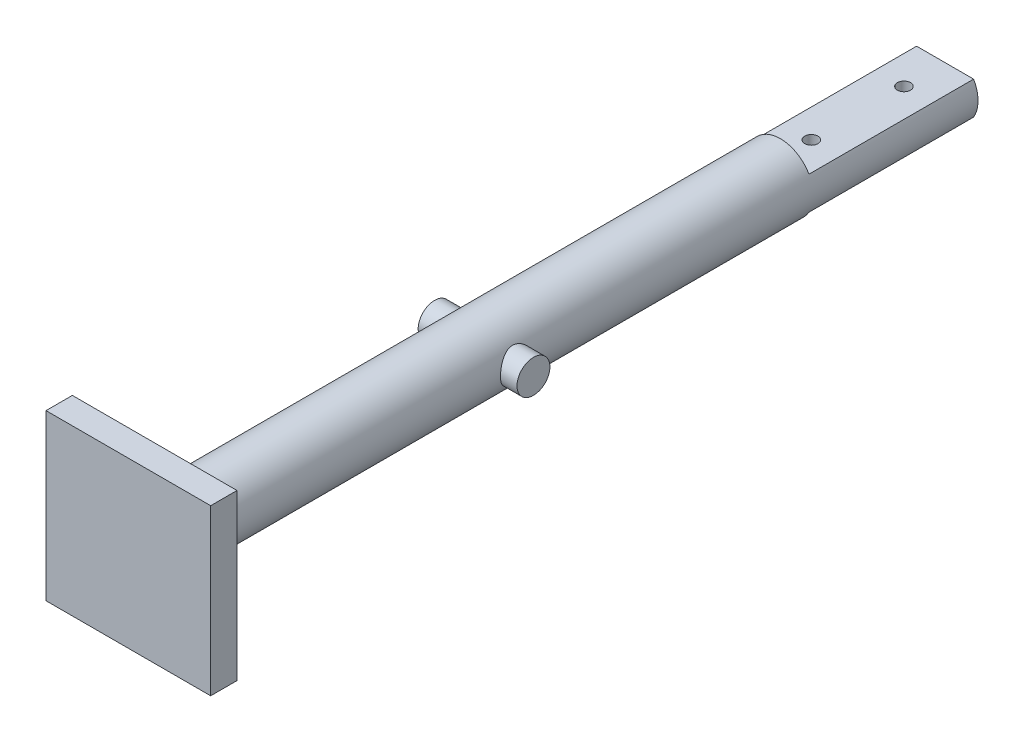
ISO-10303-21;
HEADER;
FILE_DESCRIPTION(('STEP AP214'),'2;1');
FILE_NAME('part.step','',(''),(''),'','','');
FILE_SCHEMA(('AUTOMOTIVE_DESIGN { 1 0 10303 214 1 1 1 1 }'));
ENDSEC;
DATA;
#1=APPLICATION_CONTEXT('core data for automotive mechanical design processes');
#2=APPLICATION_PROTOCOL_DEFINITION('international standard','automotive_design',2000,#1);
#3=PRODUCT_CONTEXT('',#1,'mechanical');
#4=PRODUCT('Part','Part','',(#3));
#5=PRODUCT_RELATED_PRODUCT_CATEGORY('part','',(#4));
#6=PRODUCT_DEFINITION_FORMATION('','',#4);
#7=PRODUCT_DEFINITION_CONTEXT('part definition',#1,'design');
#8=PRODUCT_DEFINITION('design','',#6,#7);
#9=PRODUCT_DEFINITION_SHAPE('','',#8);
#10=(LENGTH_UNIT() NAMED_UNIT(*) SI_UNIT(.MILLI.,.METRE.));
#11=(NAMED_UNIT(*) PLANE_ANGLE_UNIT() SI_UNIT($,.RADIAN.));
#12=(NAMED_UNIT(*) SI_UNIT($,.STERADIAN.) SOLID_ANGLE_UNIT());
#13=UNCERTAINTY_MEASURE_WITH_UNIT(LENGTH_MEASURE(1.E-05),#10,'distance_accuracy_value','');
#14=(GEOMETRIC_REPRESENTATION_CONTEXT(3) GLOBAL_UNCERTAINTY_ASSIGNED_CONTEXT((#13)) GLOBAL_UNIT_ASSIGNED_CONTEXT((#10,
#11,#12)) REPRESENTATION_CONTEXT('',''));
#15=CARTESIAN_POINT('',(0.,0.,0.));
#16=DIRECTION('',(0.,0.,1.));
#17=DIRECTION('',(1.,0.,0.));
#18=AXIS2_PLACEMENT_3D('',#15,#16,#17);
#19=CARTESIAN_POINT('',(0.,0.,152.4));
#20=DIRECTION('',(0.,0.,-1.));
#21=DIRECTION('',(-1.,0.,0.));
#22=AXIS2_PLACEMENT_3D('',#19,#20,#21);
#23=CYLINDRICAL_SURFACE('',#22,12.7);
#24=CARTESIAN_POINT('',(0.,0.,152.4));
#25=DIRECTION('',(0.,0.,1.));
#26=DIRECTION('',(1.,0.,0.));
#27=AXIS2_PLACEMENT_3D('',#24,#25,#26);
#28=CIRCLE('',#27,12.7);
#29=CARTESIAN_POINT('',(12.7,0.,152.4));
#30=VERTEX_POINT('',#29);
#31=EDGE_CURVE('E134',#30,#30,#28,.T.);
#32=ORIENTED_EDGE('',*,*,#31,.F.);
#33=EDGE_LOOP('',(#32));
#34=FACE_BOUND('',#33,.T.);
#35=CARTESIAN_POINT('',(12.7,0.,31.75));
#36=CARTESIAN_POINT('',(12.6999994891774,-0.166990879194916,31.7499994421759));
#37=CARTESIAN_POINT('',(12.6966986728259,-0.333993450198633,31.7434051711993));
#38=CARTESIAN_POINT('',(12.6835786203218,-0.666768526640046,31.7171033286682));
#39=CARTESIAN_POINT('',(12.6737565484519,-0.832540465223131,31.6973900524076));
#40=CARTESIAN_POINT('',(12.6478292478082,-1.16177467728404,31.6450462013111));
#41=CARTESIAN_POINT('',(12.6317150589571,-1.32523331106835,31.6123972048197));
#42=CARTESIAN_POINT('',(12.5936085062318,-1.64849348247789,31.5345436700231));
#43=CARTESIAN_POINT('',(12.5716137398496,-1.80829349634147,31.4893339997623));
#44=CARTESIAN_POINT('',(12.5223959142721,-2.12244180878878,31.3870611803294));
#45=CARTESIAN_POINT('',(12.4951959650805,-2.27681076158406,31.3300503379438));
#46=CARTESIAN_POINT('',(12.4361502699189,-2.57993454237572,31.2046002780589));
#47=CARTESIAN_POINT('',(12.4043027843762,-2.72868724185101,31.1361567799234));
#48=CARTESIAN_POINT('',(12.302881193969,-3.16512812193647,30.9145916735138));
#49=CARTESIAN_POINT('',(12.2273713354024,-3.44334503957524,30.7451216410392));
#50=CARTESIAN_POINT('',(12.0622186773861,-3.98471796121714,30.3560574939862));
#51=CARTESIAN_POINT('',(11.9719972312188,-4.24594454614362,30.1340512417935));
#52=CARTESIAN_POINT('',(11.7893960148839,-4.72936553155196,29.6511481911964));
#53=CARTESIAN_POINT('',(11.6970146601478,-4.95153018780439,29.3902220337443));
#54=CARTESIAN_POINT('',(11.5603243398217,-5.25955398778229,28.9628248667093));
#55=CARTESIAN_POINT('',(11.5134721485475,-5.36106270491311,28.8082038937614));
#56=CARTESIAN_POINT('',(11.4233099497228,-5.55058368760465,28.4899476154752));
#57=CARTESIAN_POINT('',(11.3799984680683,-5.63860158329209,28.3263161094703));
#58=CARTESIAN_POINT('',(11.2984098057888,-5.80035808289101,27.9909478644053));
#59=CARTESIAN_POINT('',(11.2601322945723,-5.87409762464254,27.8192116586054));
#60=CARTESIAN_POINT('',(11.1900882100936,-6.0064578883652,27.4688169432002));
#61=CARTESIAN_POINT('',(11.1583177917589,-6.06508754416238,27.2901625962078));
#62=CARTESIAN_POINT('',(11.104259497995,-6.16347180761614,26.9380237910296));
#63=CARTESIAN_POINT('',(11.08151961136,-6.20414249112448,26.7648649825109));
#64=CARTESIAN_POINT('',(11.0438804844397,-6.27089941680449,26.4149100900955));
#65=CARTESIAN_POINT('',(11.0289809087597,-6.29698628284914,26.2381141621246));
#66=CARTESIAN_POINT('',(11.0076763086803,-6.33415533919378,25.8825907052358));
#67=CARTESIAN_POINT('',(11.0012640993806,-6.34525022098377,25.7038649394044));
#68=CARTESIAN_POINT('',(10.9972004886715,-6.3522911075755,25.3460234576935));
#69=CARTESIAN_POINT('',(10.9995482514047,-6.34823855771195,25.1669077806485));
#70=CARTESIAN_POINT('',(11.012090292946,-6.32645177136463,24.8314176981249));
#71=CARTESIAN_POINT('',(11.0213095833287,-6.31041699475489,24.6748926401298));
#72=CARTESIAN_POINT('',(11.046128374712,-6.26687134491481,24.3639094653422));
#73=CARTESIAN_POINT('',(11.0617299789813,-6.23935668847138,24.2094520472784));
#74=CARTESIAN_POINT('',(11.0988027904553,-6.17316873448519,23.903688703298));
#75=CARTESIAN_POINT('',(11.120273227066,-6.13449690187388,23.7523823664405));
#76=CARTESIAN_POINT('',(11.1684190383084,-6.04639785576763,23.4537613579966));
#77=CARTESIAN_POINT('',(11.1950964580098,-5.99696641549927,23.3064482807581));
#78=CARTESIAN_POINT('',(11.2831376118079,-5.83067999912413,22.8650712730653));
#79=CARTESIAN_POINT('',(11.351625656313,-5.69733157989736,22.5784494378061));
#80=CARTESIAN_POINT('',(11.500071400071,-5.39139880582654,22.0304231498828));
#81=CARTESIAN_POINT('',(11.5800342452273,-5.2187968272065,21.76903009957));
#82=CARTESIAN_POINT('',(11.7546812882032,-4.81373716307424,21.2438125690412));
#83=CARTESIAN_POINT('',(11.8499465086129,-4.57646495884523,20.9838823296492));
#84=CARTESIAN_POINT('',(12.0362854764244,-4.06112275052911,20.5057965991382));
#85=CARTESIAN_POINT('',(12.1273572049436,-3.78303336001456,20.2876610728589));
#86=CARTESIAN_POINT('',(12.255938857257,-3.33286643739698,19.9917786254828));
#87=CARTESIAN_POINT('',(12.2983050254296,-3.17335722609792,19.8966401532776));
#88=CARTESIAN_POINT('',(12.3782218301755,-2.84569771626439,19.7202932887563));
#89=CARTESIAN_POINT('',(12.4157746297482,-2.67755134695863,19.6390786338707));
#90=CARTESIAN_POINT('',(12.4849579292559,-2.33378760343932,19.4914534288931));
#91=CARTESIAN_POINT('',(12.5165907293456,-2.15817316355139,19.4250371271345));
#92=CARTESIAN_POINT('',(12.5729876360055,-1.80074808519268,19.3077783400175));
#93=CARTESIAN_POINT('',(12.5977525327026,-1.61893816219403,19.2569340630848));
#94=CARTESIAN_POINT('',(12.6378915597613,-1.26593635485429,19.1750530402546));
#95=CARTESIAN_POINT('',(12.6538736459652,-1.09511243698787,19.1427244136913));
#96=CARTESIAN_POINT('',(12.6789562420375,-0.750891318848445,19.0921544116368));
#97=CARTESIAN_POINT('',(12.6880571262137,-0.577494259066557,19.0739122699002));
#98=CARTESIAN_POINT('',(12.6991158370576,-0.229629611373425,19.0517612761007));
#99=CARTESIAN_POINT('',(12.7010765197081,-0.0551624794535693,19.0478466932071));
#100=CARTESIAN_POINT('',(12.6978059034872,0.293430507417566,19.0543886079494));
#101=CARTESIAN_POINT('',(12.6925749229034,0.467556377130832,19.0648444695801));
#102=CARTESIAN_POINT('',(12.6757555094506,0.80050953674407,19.0986136315206));
#103=CARTESIAN_POINT('',(12.6646934781011,0.959472887164146,19.1208630740019));
#104=CARTESIAN_POINT('',(12.6368459564446,1.2748284005213,19.1772211624817));
#105=CARTESIAN_POINT('',(12.6200585231077,1.43121967165999,19.2113338345825));
#106=CARTESIAN_POINT('',(12.581159973299,1.74030776864039,19.291047952959));
#107=CARTESIAN_POINT('',(12.5590505630802,1.89300576133385,19.3366457172722));
#108=CARTESIAN_POINT('',(12.5099971792976,2.19390570072534,19.4389143910584));
#109=CARTESIAN_POINT('',(12.4830513245292,2.34210587161403,19.4955896100324));
#110=CARTESIAN_POINT('',(12.4240951779885,2.6372585623889,19.6212622939719));
#111=CARTESIAN_POINT('',(12.3919635638501,2.78405822350622,19.6905620050969));
#112=CARTESIAN_POINT('',(12.32392525103,3.07126756713195,19.8397813940777));
#113=CARTESIAN_POINT('',(12.2880172735192,3.21167506178122,19.9197046719357));
#114=CARTESIAN_POINT('',(12.1757741292216,3.62227376445688,20.1745491136814));
#115=CARTESIAN_POINT('',(12.0948877082824,3.88199540128409,20.364611078788));
#116=CARTESIAN_POINT('',(11.9194499483036,4.39279994151145,20.8011398441673));
#117=CARTESIAN_POINT('',(11.8243367236915,4.64052990372701,21.0513128051332));
#118=CARTESIAN_POINT('',(11.6839772811164,4.9789239543965,21.4549100898515));
#119=CARTESIAN_POINT('',(11.6375432562751,5.08625380253176,21.5942761051402));
#120=CARTESIAN_POINT('',(11.5466734049483,5.28929908879009,21.881933742679));
#121=CARTESIAN_POINT('',(11.5022378780468,5.38501278922794,22.0302266953779));
#122=CARTESIAN_POINT('',(11.4145838039713,5.56849389071525,22.3424281006111));
#123=CARTESIAN_POINT('',(11.3715304916549,5.65564549590477,22.5067454440508));
#124=CARTESIAN_POINT('',(11.290579644901,5.81556909376681,22.8433705339));
#125=CARTESIAN_POINT('',(11.2526796279935,5.88834801781484,23.015674378989));
#126=CARTESIAN_POINT('',(11.1834979926119,6.01870593214495,23.3670791641593));
#127=CARTESIAN_POINT('',(11.1522110654534,6.07629712370974,23.5461745150593));
#128=CARTESIAN_POINT('',(11.0975495796607,6.17556605056229,23.9098983380202));
#129=CARTESIAN_POINT('',(11.0741737959829,6.21724624980145,24.0945259485842));
#130=CARTESIAN_POINT('',(11.038221566145,6.28083303239844,24.4497382585254));
#131=CARTESIAN_POINT('',(11.0248238589961,6.30425367574492,24.6199696991849));
#132=CARTESIAN_POINT('',(11.0059068618669,6.33722186745437,24.9622059736914));
#133=CARTESIAN_POINT('',(11.0003870360907,6.34677035930014,25.1342106861318));
#134=CARTESIAN_POINT('',(10.9974561088362,6.35184755649859,25.4784312834341));
#135=CARTESIAN_POINT('',(11.0000420081603,6.34738144738997,25.6506470666262));
#136=CARTESIAN_POINT('',(11.0132073594892,6.32451076696087,25.9938336660463));
#137=CARTESIAN_POINT('',(11.023786484255,6.3061067662514,26.1648045329513));
#138=CARTESIAN_POINT('',(11.0511312712702,6.25804920718462,26.4878296898959));
#139=CARTESIAN_POINT('',(11.0672085028909,6.22963986719981,26.6401293180212));
#140=CARTESIAN_POINT('',(11.1050268373618,6.16196939123336,26.9416003606676));
#141=CARTESIAN_POINT('',(11.1267698205995,6.12270465222518,27.0907707188326));
#142=CARTESIAN_POINT('',(11.1995485940621,5.98919755549727,27.5322243315877));
#143=CARTESIAN_POINT('',(11.2581531108883,5.87921095671372,27.8186570190923));
#144=CARTESIAN_POINT('',(11.3937155944897,5.61221709335547,28.3885160055318));
#145=CARTESIAN_POINT('',(11.4716421113511,5.4525471930957,28.6704473974524));
#146=CARTESIAN_POINT('',(11.635439817654,5.09367320950778,29.2053730733707));
#147=CARTESIAN_POINT('',(11.7213151279082,4.89444855823947,29.4583521942334));
#148=CARTESIAN_POINT('',(11.9038699110716,4.43354035272872,29.9602382551382));
#149=CARTESIAN_POINT('',(12.0005943076297,4.1672089491442,30.2049154327347));
#150=CARTESIAN_POINT('',(12.1383310810892,3.73813634318358,30.5363060499741));
#151=CARTESIAN_POINT('',(12.1830529217554,3.59004569732539,30.6409050919539));
#152=CARTESIAN_POINT('',(12.2688872478125,3.28473589884858,30.8374551775996));
#153=CARTESIAN_POINT('',(12.3100013738234,3.12752095014406,30.9294119812597));
#154=CARTESIAN_POINT('',(12.3878055405892,2.80361177397836,31.1005331085148));
#155=CARTESIAN_POINT('',(12.4244591999769,2.63685404738455,31.1795938199596));
#156=CARTESIAN_POINT('',(12.4919115290982,2.2961439976254,31.3232062854184));
#157=CARTESIAN_POINT('',(12.5227130740716,2.12219525894012,31.3877651672764));
#158=CARTESIAN_POINT('',(12.5775008101552,1.7687253413974,31.5015167403403));
#159=CARTESIAN_POINT('',(12.6015018553988,1.58921727277204,31.5507429460023));
#160=CARTESIAN_POINT('',(12.642019952057,1.22585054083135,31.6333352690337));
#161=CARTESIAN_POINT('',(12.6585415748002,1.04199460738347,31.6667110745812));
#162=CARTESIAN_POINT('',(12.6806500718221,0.715063028653894,31.7112325619244));
#163=CARTESIAN_POINT('',(12.6878936037074,0.572548812651051,31.725757901848));
#164=CARTESIAN_POINT('',(12.6975688534566,0.286692618188954,31.7451419937193));
#165=CARTESIAN_POINT('',(12.7000004385074,0.14335061699176,31.7500004788551));
#166=CARTESIAN_POINT('',(12.7,0.,31.75));
#167=B_SPLINE_CURVE_WITH_KNOTS('',3,(#35,#36,#37,#38,#39,#40,#41,#42,#43,#44,#45,#46,#47,#48,
#49,#50,#51,#52,#53,#54,#55,#56,#57,#58,#59,#60,#61,#62,#63,#64,#65,#66,#67,#68,#69,#70,#71,#72,
#73,#74,#75,#76,#77,#78,#79,#80,#81,#82,#83,#84,#85,#86,#87,#88,#89,#90,#91,#92,#93,#94,#95,#96,
#97,#98,#99,#100,#101,#102,#103,#104,#105,#106,#107,#108,#109,#110,#111,#112,#113,#114,#115,
#116,#117,#118,#119,#120,#121,#122,#123,#124,#125,#126,#127,#128,#129,#130,#131,#132,#133,#134,
#135,#136,#137,#138,#139,#140,#141,#142,#143,#144,#145,#146,#147,#148,#149,#150,#151,#152,#153,
#154,#155,#156,#157,#158,#159,#160,#161,#162,#163,#164,#165,#166),.UNSPECIFIED.,.T.,.F.,(4,2,2,
2,2,2,2,2,2,2,2,2,2,2,2,2,2,2,2,2,2,2,2,2,2,2,2,2,2,2,2,2,2,2,2,2,2,2,2,2,2,2,2,2,2,2,2,2,2,2,2,
2,2,2,2,2,2,2,2,2,2,2,2,2,2,4),(0.,0.50083122420536,1.00188037372803,1.50364564290689,
2.0056162222071,2.50540779268628,3.0053869172507,4.00425210956756,5.06354639773446,
6.12364383897773,6.69546056113472,7.26703799333407,7.83857787007116,8.40977904053159,
8.94696617231636,9.48413032231427,10.020839449589,10.5574973665628,11.0297819407841,
11.5022222802449,11.9746006167425,12.447164856978,13.4133450583963,14.3799599077215,
15.4691385823987,16.558836254714,17.1296896955319,17.7002857039293,18.2706595507726,
18.8409677509571,19.3640345307036,19.8870728558157,20.4099019497636,20.9327079051584,
21.4148301207384,21.8971161172382,22.3792476958438,22.8615672144633,23.3574791185916,
23.8535595025871,24.8452132673351,25.9342484207189,26.4795520760265,27.0249372042286,
27.5969396508644,28.1686655660688,28.7399307681394,29.3111074690516,29.8274552059119,
30.3437678229116,30.8598894217494,31.3759898919437,31.8427315926275,32.3096283963947,
33.2427989036526,34.2386648311406,35.2350499582129,36.3525027406484,36.9121724680045,
37.4715863502977,38.0352942497766,38.5987244700203,39.1609143479984,39.7227601571806,
40.1526787482413,40.5826092051903),.UNSPECIFIED.);
#168=CARTESIAN_POINT('',(12.7,0.,31.75));
#169=VERTEX_POINT('',#168);
#170=EDGE_CURVE('E140',#169,#169,#167,.T.);
#171=ORIENTED_EDGE('',*,*,#170,.F.);
#172=EDGE_LOOP('',(#171));
#173=FACE_BOUND('',#172,.T.);
#174=CARTESIAN_POINT('',(-12.7,0.,31.75));
#175=CARTESIAN_POINT('',(-12.6999994891774,0.166990879194912,31.7499994421759));
#176=CARTESIAN_POINT('',(-12.6966986728259,0.333993450198629,31.7434051711993));
#177=CARTESIAN_POINT('',(-12.6835786203218,0.666768526640042,31.7171033286682));
#178=CARTESIAN_POINT('',(-12.6737565484519,0.832540465223127,31.6973900524076));
#179=CARTESIAN_POINT('',(-12.6478292478082,1.16177467728403,31.6450462013111));
#180=CARTESIAN_POINT('',(-12.6317150589571,1.32523331106835,31.6123972048197));
#181=CARTESIAN_POINT('',(-12.5936085062318,1.64849348247789,31.5345436700231));
#182=CARTESIAN_POINT('',(-12.5716137398496,1.80829349634147,31.4893339997623));
#183=CARTESIAN_POINT('',(-12.5223959142721,2.12244180878878,31.3870611803294));
#184=CARTESIAN_POINT('',(-12.4951959650805,2.27681076158406,31.3300503379438));
#185=CARTESIAN_POINT('',(-12.4361502699189,2.57993454237572,31.2046002780589));
#186=CARTESIAN_POINT('',(-12.4043027843762,2.728687241851,31.1361567799234));
#187=CARTESIAN_POINT('',(-12.302881193969,3.16512812193646,30.9145916735138));
#188=CARTESIAN_POINT('',(-12.2273713354024,3.44334503957524,30.7451216410392));
#189=CARTESIAN_POINT('',(-12.0622186773861,3.98471796121714,30.3560574939862));
#190=CARTESIAN_POINT('',(-11.9719972312188,4.24594454614362,30.1340512417935));
#191=CARTESIAN_POINT('',(-11.7893960148839,4.72936553155196,29.6511481911964));
#192=CARTESIAN_POINT('',(-11.6970146601478,4.95153018780439,29.3902220337443));
#193=CARTESIAN_POINT('',(-11.5603243398217,5.25955398778229,28.9628248667093));
#194=CARTESIAN_POINT('',(-11.5134721485475,5.3610627049131,28.8082038937614));
#195=CARTESIAN_POINT('',(-11.4233099497228,5.55058368760464,28.4899476154752));
#196=CARTESIAN_POINT('',(-11.3799984680683,5.63860158329209,28.3263161094703));
#197=CARTESIAN_POINT('',(-11.2984098057888,5.80035808289101,27.9909478644052));
#198=CARTESIAN_POINT('',(-11.2601322945723,5.87409762464253,27.8192116586054));
#199=CARTESIAN_POINT('',(-11.1900882100936,6.00645788836519,27.4688169432001));
#200=CARTESIAN_POINT('',(-11.1583177917589,6.06508754416238,27.2901625962078));
#201=CARTESIAN_POINT('',(-11.104259497995,6.16347180761614,26.9380237910296));
#202=CARTESIAN_POINT('',(-11.08151961136,6.20414249112448,26.7648649825109));
#203=CARTESIAN_POINT('',(-11.0438804844397,6.27089941680448,26.4149100900955));
#204=CARTESIAN_POINT('',(-11.0289809087597,6.29698628284913,26.2381141621246));
#205=CARTESIAN_POINT('',(-11.0076763086803,6.33415533919377,25.8825907052358));
#206=CARTESIAN_POINT('',(-11.0012640993806,6.34525022098377,25.7038649394044));
#207=CARTESIAN_POINT('',(-10.9972004886715,6.35229110757549,25.3460234576935));
#208=CARTESIAN_POINT('',(-10.9995482514047,6.34823855771194,25.1669077806485));
#209=CARTESIAN_POINT('',(-11.012090292946,6.32645177136462,24.8314176981249));
#210=CARTESIAN_POINT('',(-11.0213095833287,6.31041699475488,24.6748926401298));
#211=CARTESIAN_POINT('',(-11.046128374712,6.2668713449148,24.3639094653422));
#212=CARTESIAN_POINT('',(-11.0617299789813,6.23935668847137,24.2094520472784));
#213=CARTESIAN_POINT('',(-11.0988027904553,6.17316873448519,23.903688703298));
#214=CARTESIAN_POINT('',(-11.120273227066,6.13449690187387,23.7523823664405));
#215=CARTESIAN_POINT('',(-11.1684190383084,6.04639785576762,23.4537613579966));
#216=CARTESIAN_POINT('',(-11.1950964580098,5.99696641549926,23.3064482807581));
#217=CARTESIAN_POINT('',(-11.2831376118079,5.83067999912412,22.8650712730653));
#218=CARTESIAN_POINT('',(-11.351625656313,5.69733157989735,22.5784494378061));
#219=CARTESIAN_POINT('',(-11.500071400071,5.39139880582653,22.0304231498828));
#220=CARTESIAN_POINT('',(-11.5800342452273,5.21879682720649,21.76903009957));
#221=CARTESIAN_POINT('',(-11.7546812882033,4.81373716307423,21.2438125690412));
#222=CARTESIAN_POINT('',(-11.8499465086129,4.57646495884523,20.9838823296492));
#223=CARTESIAN_POINT('',(-12.0362854764244,4.0611227505291,20.5057965991382));
#224=CARTESIAN_POINT('',(-12.1273572049436,3.78303336001455,20.2876610728588));
#225=CARTESIAN_POINT('',(-12.255938857257,3.33286643739697,19.9917786254828));
#226=CARTESIAN_POINT('',(-12.2983050254296,3.17335722609791,19.8966401532776));
#227=CARTESIAN_POINT('',(-12.3782218301755,2.84569771626438,19.7202932887563));
#228=CARTESIAN_POINT('',(-12.4157746297482,2.67755134695862,19.6390786338707));
#229=CARTESIAN_POINT('',(-12.484957929256,2.33378760343931,19.4914534288931));
#230=CARTESIAN_POINT('',(-12.5165907293456,2.15817316355138,19.4250371271345));
#231=CARTESIAN_POINT('',(-12.5729876360055,1.80074808519266,19.3077783400175));
#232=CARTESIAN_POINT('',(-12.5977525327026,1.61893816219401,19.2569340630848));
#233=CARTESIAN_POINT('',(-12.6378915597613,1.26593635485428,19.1750530402546));
#234=CARTESIAN_POINT('',(-12.6538736459652,1.09511243698786,19.1427244136913));
#235=CARTESIAN_POINT('',(-12.6789562420375,0.750891318848433,19.0921544116368));
#236=CARTESIAN_POINT('',(-12.6880571262137,0.577494259066545,19.0739122699002));
#237=CARTESIAN_POINT('',(-12.6991158370576,0.229629611373413,19.0517612761007));
#238=CARTESIAN_POINT('',(-12.7010765197081,0.0551624794535576,19.0478466932071));
#239=CARTESIAN_POINT('',(-12.6978059034872,-0.293430507417578,19.0543886079494));
#240=CARTESIAN_POINT('',(-12.6925749229034,-0.467556377130844,19.0648444695801));
#241=CARTESIAN_POINT('',(-12.6757555094506,-0.800509536744081,19.0986136315206));
#242=CARTESIAN_POINT('',(-12.6646934781011,-0.959472887164157,19.1208630740019));
#243=CARTESIAN_POINT('',(-12.6368459564446,-1.27482840052131,19.1772211624817));
#244=CARTESIAN_POINT('',(-12.6200585231077,-1.43121967166,19.2113338345825));
#245=CARTESIAN_POINT('',(-12.581159973299,-1.7403077686404,19.291047952959));
#246=CARTESIAN_POINT('',(-12.5590505630801,-1.89300576133387,19.3366457172722));
#247=CARTESIAN_POINT('',(-12.5099971792976,-2.19390570072536,19.4389143910584));
#248=CARTESIAN_POINT('',(-12.4830513245292,-2.34210587161405,19.4955896100324));
#249=CARTESIAN_POINT('',(-12.4240951779885,-2.63725856238892,19.6212622939719));
#250=CARTESIAN_POINT('',(-12.3919635638501,-2.78405822350623,19.6905620050969));
#251=CARTESIAN_POINT('',(-12.32392525103,-3.07126756713197,19.8397813940777));
#252=CARTESIAN_POINT('',(-12.2880172735192,-3.21167506178123,19.9197046719357));
#253=CARTESIAN_POINT('',(-12.1757741292216,-3.62227376445689,20.1745491136814));
#254=CARTESIAN_POINT('',(-12.0948877082824,-3.8819954012841,20.3646110787881));
#255=CARTESIAN_POINT('',(-11.9194499483036,-4.39279994151146,20.8011398441674));
#256=CARTESIAN_POINT('',(-11.8243367236915,-4.64052990372702,21.0513128051332));
#257=CARTESIAN_POINT('',(-11.6839772811164,-4.97892395439651,21.4549100898515));
#258=CARTESIAN_POINT('',(-11.6375432562751,-5.08625380253177,21.5942761051402));
#259=CARTESIAN_POINT('',(-11.5466734049483,-5.2892990887901,21.881933742679));
#260=CARTESIAN_POINT('',(-11.5022378780468,-5.38501278922796,22.0302266953779));
#261=CARTESIAN_POINT('',(-11.4145838039713,-5.56849389071526,22.3424281006111));
#262=CARTESIAN_POINT('',(-11.3715304916549,-5.65564549590478,22.5067454440508));
#263=CARTESIAN_POINT('',(-11.290579644901,-5.81556909376682,22.8433705339));
#264=CARTESIAN_POINT('',(-11.2526796279935,-5.88834801781484,23.015674378989));
#265=CARTESIAN_POINT('',(-11.1834979926119,-6.01870593214496,23.3670791641593));
#266=CARTESIAN_POINT('',(-11.1522110654534,-6.07629712370975,23.5461745150593));
#267=CARTESIAN_POINT('',(-11.0975495796607,-6.1755660505623,23.9098983380202));
#268=CARTESIAN_POINT('',(-11.0741737959829,-6.21724624980146,24.0945259485842));
#269=CARTESIAN_POINT('',(-11.038221566145,-6.28083303239844,24.4497382585254));
#270=CARTESIAN_POINT('',(-11.0248238589961,-6.30425367574493,24.6199696991849));
#271=CARTESIAN_POINT('',(-11.0059068618669,-6.33722186745438,24.9622059736914));
#272=CARTESIAN_POINT('',(-11.0003870360907,-6.34677035930015,25.1342106861318));
#273=CARTESIAN_POINT('',(-10.9974561088362,-6.3518475564986,25.4784312834341));
#274=CARTESIAN_POINT('',(-11.0000420081603,-6.34738144738997,25.6506470666262));
#275=CARTESIAN_POINT('',(-11.0132073594892,-6.32451076696088,25.9938336660463));
#276=CARTESIAN_POINT('',(-11.023786484255,-6.30610676625141,26.1648045329513));
#277=CARTESIAN_POINT('',(-11.0511312712702,-6.25804920718463,26.4878296898959));
#278=CARTESIAN_POINT('',(-11.0672085028909,-6.22963986719981,26.6401293180212));
#279=CARTESIAN_POINT('',(-11.1050268373618,-6.16196939123336,26.9416003606676));
#280=CARTESIAN_POINT('',(-11.1267698205995,-6.12270465222518,27.0907707188327));
#281=CARTESIAN_POINT('',(-11.1995485940621,-5.98919755549727,27.5322243315877));
#282=CARTESIAN_POINT('',(-11.2581531108883,-5.87921095671373,27.8186570190923));
#283=CARTESIAN_POINT('',(-11.3937155944897,-5.61221709335547,28.3885160055318));
#284=CARTESIAN_POINT('',(-11.4716421113511,-5.4525471930957,28.6704473974524));
#285=CARTESIAN_POINT('',(-11.635439817654,-5.09367320950779,29.2053730733707));
#286=CARTESIAN_POINT('',(-11.7213151279082,-4.89444855823948,29.4583521942334));
#287=CARTESIAN_POINT('',(-11.9038699110716,-4.43354035272872,29.9602382551382));
#288=CARTESIAN_POINT('',(-12.0005943076297,-4.1672089491442,30.2049154327347));
#289=CARTESIAN_POINT('',(-12.1383310810892,-3.73813634318358,30.5363060499741));
#290=CARTESIAN_POINT('',(-12.1830529217554,-3.5900456973254,30.6409050919539));
#291=CARTESIAN_POINT('',(-12.2688872478125,-3.28473589884859,30.8374551775996));
#292=CARTESIAN_POINT('',(-12.3100013738234,-3.12752095014407,30.9294119812597));
#293=CARTESIAN_POINT('',(-12.3878055405892,-2.80361177397837,31.1005331085148));
#294=CARTESIAN_POINT('',(-12.4244591999769,-2.63685404738456,31.1795938199596));
#295=CARTESIAN_POINT('',(-12.4919115290982,-2.29614399762541,31.3232062854184));
#296=CARTESIAN_POINT('',(-12.5227130740716,-2.12219525894012,31.3877651672764));
#297=CARTESIAN_POINT('',(-12.5775008101552,-1.76872534139741,31.5015167403403));
#298=CARTESIAN_POINT('',(-12.6015018553988,-1.58921727277205,31.5507429460023));
#299=CARTESIAN_POINT('',(-12.642019952057,-1.22585054083135,31.6333352690337));
#300=CARTESIAN_POINT('',(-12.6585415748002,-1.04199460738348,31.6667110745812));
#301=CARTESIAN_POINT('',(-12.6806500718221,-0.715063028653899,31.7112325619244));
#302=CARTESIAN_POINT('',(-12.6878936037074,-0.572548812651056,31.725757901848));
#303=CARTESIAN_POINT('',(-12.6975688534566,-0.286692618188958,31.7451419937193));
#304=CARTESIAN_POINT('',(-12.7000004385074,-0.143350616991764,31.7500004788551));
#305=CARTESIAN_POINT('',(-12.7,0.,31.75));
#306=B_SPLINE_CURVE_WITH_KNOTS('',3,(#174,#175,#176,#177,#178,#179,#180,#181,#182,#183,#184,
#185,#186,#187,#188,#189,#190,#191,#192,#193,#194,#195,#196,#197,#198,#199,#200,#201,#202,#203,
#204,#205,#206,#207,#208,#209,#210,#211,#212,#213,#214,#215,#216,#217,#218,#219,#220,#221,#222,
#223,#224,#225,#226,#227,#228,#229,#230,#231,#232,#233,#234,#235,#236,#237,#238,#239,#240,#241,
#242,#243,#244,#245,#246,#247,#248,#249,#250,#251,#252,#253,#254,#255,#256,#257,#258,#259,#260,
#261,#262,#263,#264,#265,#266,#267,#268,#269,#270,#271,#272,#273,#274,#275,#276,#277,#278,#279,
#280,#281,#282,#283,#284,#285,#286,#287,#288,#289,#290,#291,#292,#293,#294,#295,#296,#297,#298,
#299,#300,#301,#302,#303,#304,#305),.UNSPECIFIED.,.T.,.F.,(4,2,2,2,2,2,2,2,2,2,2,2,2,2,2,2,2,2,
2,2,2,2,2,2,2,2,2,2,2,2,2,2,2,2,2,2,2,2,2,2,2,2,2,2,2,2,2,2,2,2,2,2,2,2,2,2,2,2,2,2,2,2,2,2,2,
4),(0.,0.500831224205359,1.00188037372803,1.50364564290689,2.0056162222071,2.50540779268628,
3.0053869172507,4.00425210956756,5.06354639773447,6.12364383897773,6.69546056113472,
7.26703799333407,7.83857787007117,8.4097790405316,8.94696617231636,9.48413032231427,
10.020839449589,10.5574973665628,11.0297819407841,11.5022222802449,11.9746006167425,
12.447164856978,13.4133450583963,14.3799599077215,15.4691385823987,16.558836254714,
17.1296896955319,17.7002857039293,18.2706595507726,18.8409677509571,19.3640345307036,
19.8870728558157,20.4099019497636,20.9327079051584,21.4148301207384,21.8971161172382,
22.3792476958438,22.8615672144633,23.3574791185916,23.8535595025871,24.8452132673351,
25.9342484207189,26.4795520760265,27.0249372042286,27.5969396508645,28.1686655660688,
28.7399307681394,29.3111074690516,29.8274552059119,30.3437678229116,30.8598894217494,
31.3759898919437,31.8427315926276,32.3096283963947,33.2427989036526,34.2386648311406,
35.2350499582129,36.3525027406484,36.9121724680045,37.4715863502977,38.0352942497766,
38.5987244700203,39.1609143479984,39.7227601571806,40.1526787482413,40.5826092051903),.UNSPECIFIED.);
#307=CARTESIAN_POINT('',(-12.7,0.,31.75));
#308=VERTEX_POINT('',#307);
#309=EDGE_CURVE('E148',#308,#308,#306,.T.);
#310=ORIENTED_EDGE('',*,*,#309,.F.);
#311=EDGE_LOOP('',(#310));
#312=FACE_BOUND('',#311,.T.);
#313=DIRECTION('',(0.,0.,-1.));
#314=VECTOR('',#313,1.);
#315=CARTESIAN_POINT('',(10.9985226280624,6.35,152.4));
#316=LINE('',#315,#314);
#317=CARTESIAN_POINT('',(10.9985226280624,6.35,-88.8999999999998));
#318=VERTEX_POINT('',#317);
#319=CARTESIAN_POINT('',(10.9985226280624,6.35,-152.4));
#320=VERTEX_POINT('',#319);
#321=EDGE_CURVE('E63',#318,#320,#316,.T.);
#322=ORIENTED_EDGE('',*,*,#321,.F.);
#323=CARTESIAN_POINT('',(0.,0.,-88.8999999999998));
#324=DIRECTION('',(0.,0.,-1.));
#325=DIRECTION('',(-1.,0.,0.));
#326=AXIS2_PLACEMENT_3D('',#323,#324,#325);
#327=CIRCLE('',#326,12.7);
#328=CARTESIAN_POINT('',(-10.9985226280624,6.35,-88.8999999999998));
#329=VERTEX_POINT('',#328);
#330=EDGE_CURVE('E11',#329,#318,#327,.T.);
#331=ORIENTED_EDGE('',*,*,#330,.F.);
#332=DIRECTION('',(0.,0.,-1.));
#333=VECTOR('',#332,1.);
#334=CARTESIAN_POINT('',(-10.9985226280624,6.35,152.4));
#335=LINE('',#334,#333);
#336=CARTESIAN_POINT('',(-10.9985226280624,6.35,-152.4));
#337=VERTEX_POINT('',#336);
#338=EDGE_CURVE('E113',#337,#329,#335,.F.);
#339=ORIENTED_EDGE('',*,*,#338,.F.);
#340=CARTESIAN_POINT('',(0.,0.,-152.4));
#341=DIRECTION('',(0.,0.,1.));
#342=DIRECTION('',(1.,0.,0.));
#343=AXIS2_PLACEMENT_3D('',#340,#341,#342);
#344=CIRCLE('',#343,12.7);
#345=CARTESIAN_POINT('',(-10.9985226280624,-6.35,-152.4));
#346=VERTEX_POINT('',#345);
#347=EDGE_CURVE('E71',#337,#346,#344,.T.);
#348=ORIENTED_EDGE('',*,*,#347,.T.);
#349=DIRECTION('',(0.,0.,-1.));
#350=VECTOR('',#349,1.);
#351=CARTESIAN_POINT('',(-10.9985226280624,-6.35,152.4));
#352=LINE('',#351,#350);
#353=CARTESIAN_POINT('',(-10.9985226280624,-6.35,-88.8999999999998));
#354=VERTEX_POINT('',#353);
#355=EDGE_CURVE('E215',#354,#346,#352,.T.);
#356=ORIENTED_EDGE('',*,*,#355,.F.);
#357=CARTESIAN_POINT('',(0.,0.,-88.8999999999998));
#358=DIRECTION('',(0.,0.,1.));
#359=DIRECTION('',(1.,0.,0.));
#360=AXIS2_PLACEMENT_3D('',#357,#358,#359);
#361=CIRCLE('',#360,12.7);
#362=CARTESIAN_POINT('',(10.9985226280624,-6.35,-88.8999999999998));
#363=VERTEX_POINT('',#362);
#364=EDGE_CURVE('E119',#354,#363,#361,.T.);
#365=ORIENTED_EDGE('',*,*,#364,.T.);
#366=DIRECTION('',(0.,0.,-1.));
#367=VECTOR('',#366,1.);
#368=CARTESIAN_POINT('',(10.9985226280624,-6.35,152.4));
#369=LINE('',#368,#367);
#370=CARTESIAN_POINT('',(10.9985226280624,-6.35,-152.4));
#371=VERTEX_POINT('',#370);
#372=EDGE_CURVE('E214',#371,#363,#369,.F.);
#373=ORIENTED_EDGE('',*,*,#372,.F.);
#374=EDGE_CURVE('E128',#371,#320,#344,.T.);
#375=ORIENTED_EDGE('',*,*,#374,.T.);
#376=EDGE_LOOP('',(#322,#331,#339,#348,#356,#365,#373,#375));
#377=FACE_BOUND('',#376,.T.);
#378=ADVANCED_FACE('F47',(#34,#173,#312,#377),#23,.T.);
#379=CARTESIAN_POINT('',(0.,0.,-152.4));
#380=DIRECTION('',(0.,0.,1.));
#381=DIRECTION('',(1.,0.,0.));
#382=AXIS2_PLACEMENT_3D('',#379,#380,#381);
#383=PLANE('',#382);
#384=DIRECTION('',(-1.,0.,0.));
#385=VECTOR('',#384,1.);
#386=CARTESIAN_POINT('',(0.,6.35,-152.4));
#387=LINE('',#386,#385);
#388=EDGE_CURVE('E56',#320,#337,#387,.T.);
#389=ORIENTED_EDGE('',*,*,#388,.F.);
#390=ORIENTED_EDGE('',*,*,#374,.F.);
#391=DIRECTION('',(1.,0.,0.));
#392=VECTOR('',#391,1.);
#393=CARTESIAN_POINT('',(0.,-6.35,-152.4));
#394=LINE('',#393,#392);
#395=EDGE_CURVE('E126',#346,#371,#394,.T.);
#396=ORIENTED_EDGE('',*,*,#395,.F.);
#397=ORIENTED_EDGE('',*,*,#347,.F.);
#398=EDGE_LOOP('',(#389,#390,#396,#397));
#399=FACE_BOUND('',#398,.T.);
#400=ADVANCED_FACE('F125',(#399),#383,.F.);
#401=CARTESIAN_POINT('',(-31.75,31.75,162.56));
#402=DIRECTION('',(0.,1.,0.));
#403=DIRECTION('',(0.,0.,1.));
#404=AXIS2_PLACEMENT_3D('',#401,#402,#403);
#405=PLANE('',#404);
#406=DIRECTION('',(1.,0.,0.));
#407=VECTOR('',#406,1.);
#408=CARTESIAN_POINT('',(-31.75,31.75,152.4));
#409=LINE('',#408,#407);
#410=CARTESIAN_POINT('',(-31.75,31.75,152.4));
#411=VERTEX_POINT('',#410);
#412=CARTESIAN_POINT('',(31.75,31.75,152.4));
#413=VERTEX_POINT('',#412);
#414=EDGE_CURVE('E237',#411,#413,#409,.T.);
#415=ORIENTED_EDGE('',*,*,#414,.F.);
#416=DIRECTION('',(0.,0.,-1.));
#417=VECTOR('',#416,1.);
#418=CARTESIAN_POINT('',(-31.75,31.75,162.56));
#419=LINE('',#418,#417);
#420=CARTESIAN_POINT('',(-31.75,31.75,162.56));
#421=VERTEX_POINT('',#420);
#422=EDGE_CURVE('E129',#421,#411,#419,.T.);
#423=ORIENTED_EDGE('',*,*,#422,.F.);
#424=DIRECTION('',(1.,0.,0.));
#425=VECTOR('',#424,1.);
#426=CARTESIAN_POINT('',(-31.75,31.75,162.56));
#427=LINE('',#426,#425);
#428=CARTESIAN_POINT('',(31.75,31.75,162.56));
#429=VERTEX_POINT('',#428);
#430=EDGE_CURVE('E241',#421,#429,#427,.T.);
#431=ORIENTED_EDGE('',*,*,#430,.T.);
#432=DIRECTION('',(0.,0.,-1.));
#433=VECTOR('',#432,1.);
#434=CARTESIAN_POINT('',(31.75,31.75,162.56));
#435=LINE('',#434,#433);
#436=EDGE_CURVE('E256',#429,#413,#435,.T.);
#437=ORIENTED_EDGE('',*,*,#436,.T.);
#438=EDGE_LOOP('',(#415,#423,#431,#437));
#439=FACE_BOUND('',#438,.T.);
#440=ADVANCED_FACE('F177',(#439),#405,.T.);
#441=CARTESIAN_POINT('',(-31.75,31.75,162.56));
#442=DIRECTION('',(1.,0.,0.));
#443=DIRECTION('',(0.,1.,0.));
#444=AXIS2_PLACEMENT_3D('',#441,#442,#443);
#445=PLANE('',#444);
#446=DIRECTION('',(0.,-1.,0.));
#447=VECTOR('',#446,1.);
#448=CARTESIAN_POINT('',(-31.75,31.75,152.4));
#449=LINE('',#448,#447);
#450=CARTESIAN_POINT('',(-31.75,-31.75,152.4));
#451=VERTEX_POINT('',#450);
#452=EDGE_CURVE('E246',#411,#451,#449,.T.);
#453=ORIENTED_EDGE('',*,*,#452,.T.);
#454=DIRECTION('',(0.,0.,-1.));
#455=VECTOR('',#454,1.);
#456=CARTESIAN_POINT('',(-31.75,-31.75,162.56));
#457=LINE('',#456,#455);
#458=CARTESIAN_POINT('',(-31.75,-31.75,162.56));
#459=VERTEX_POINT('',#458);
#460=EDGE_CURVE('E135',#459,#451,#457,.T.);
#461=ORIENTED_EDGE('',*,*,#460,.F.);
#462=DIRECTION('',(0.,-1.,0.));
#463=VECTOR('',#462,1.);
#464=CARTESIAN_POINT('',(-31.75,31.75,162.56));
#465=LINE('',#464,#463);
#466=EDGE_CURVE('E253',#421,#459,#465,.T.);
#467=ORIENTED_EDGE('',*,*,#466,.F.);
#468=ORIENTED_EDGE('',*,*,#422,.T.);
#469=EDGE_LOOP('',(#453,#461,#467,#468));
#470=FACE_BOUND('',#469,.T.);
#471=ADVANCED_FACE('F173',(#470),#445,.F.);
#472=CARTESIAN_POINT('',(-31.75,-31.75,162.56));
#473=DIRECTION('',(0.,1.,0.));
#474=DIRECTION('',(0.,0.,1.));
#475=AXIS2_PLACEMENT_3D('',#472,#473,#474);
#476=PLANE('',#475);
#477=DIRECTION('',(1.,0.,0.));
#478=VECTOR('',#477,1.);
#479=CARTESIAN_POINT('',(-31.75,-31.75,152.4));
#480=LINE('',#479,#478);
#481=CARTESIAN_POINT('',(31.75,-31.75,152.4));
#482=VERTEX_POINT('',#481);
#483=EDGE_CURVE('E264',#451,#482,#480,.T.);
#484=ORIENTED_EDGE('',*,*,#483,.T.);
#485=DIRECTION('',(0.,0.,-1.));
#486=VECTOR('',#485,1.);
#487=CARTESIAN_POINT('',(31.75,-31.75,162.56));
#488=LINE('',#487,#486);
#489=CARTESIAN_POINT('',(31.75,-31.75,162.56));
#490=VERTEX_POINT('',#489);
#491=EDGE_CURVE('E273',#490,#482,#488,.T.);
#492=ORIENTED_EDGE('',*,*,#491,.F.);
#493=DIRECTION('',(1.,0.,0.));
#494=VECTOR('',#493,1.);
#495=CARTESIAN_POINT('',(-31.75,-31.75,162.56));
#496=LINE('',#495,#494);
#497=EDGE_CURVE('E250',#459,#490,#496,.T.);
#498=ORIENTED_EDGE('',*,*,#497,.F.);
#499=ORIENTED_EDGE('',*,*,#460,.T.);
#500=EDGE_LOOP('',(#484,#492,#498,#499));
#501=FACE_BOUND('',#500,.T.);
#502=ADVANCED_FACE('F176',(#501),#476,.F.);
#503=CARTESIAN_POINT('',(31.75,31.75,162.56));
#504=DIRECTION('',(1.,0.,0.));
#505=DIRECTION('',(0.,1.,0.));
#506=AXIS2_PLACEMENT_3D('',#503,#504,#505);
#507=PLANE('',#506);
#508=DIRECTION('',(0.,-1.,0.));
#509=VECTOR('',#508,1.);
#510=CARTESIAN_POINT('',(31.75,31.75,152.4));
#511=LINE('',#510,#509);
#512=EDGE_CURVE('E260',#413,#482,#511,.T.);
#513=ORIENTED_EDGE('',*,*,#512,.F.);
#514=ORIENTED_EDGE('',*,*,#436,.F.);
#515=DIRECTION('',(0.,-1.,0.));
#516=VECTOR('',#515,1.);
#517=CARTESIAN_POINT('',(31.75,31.75,162.56));
#518=LINE('',#517,#516);
#519=EDGE_CURVE('E245',#429,#490,#518,.T.);
#520=ORIENTED_EDGE('',*,*,#519,.T.);
#521=ORIENTED_EDGE('',*,*,#491,.T.);
#522=EDGE_LOOP('',(#513,#514,#520,#521));
#523=FACE_BOUND('',#522,.T.);
#524=ADVANCED_FACE('F167',(#523),#507,.T.);
#525=CARTESIAN_POINT('',(0.,0.,162.56));
#526=DIRECTION('',(0.,0.,-1.));
#527=DIRECTION('',(-1.,0.,0.));
#528=AXIS2_PLACEMENT_3D('',#525,#526,#527);
#529=PLANE('',#528);
#530=ORIENTED_EDGE('',*,*,#430,.F.);
#531=ORIENTED_EDGE('',*,*,#466,.T.);
#532=ORIENTED_EDGE('',*,*,#497,.T.);
#533=ORIENTED_EDGE('',*,*,#519,.F.);
#534=EDGE_LOOP('',(#530,#531,#532,#533));
#535=FACE_BOUND('',#534,.T.);
#536=ADVANCED_FACE('F162',(#535),#529,.F.);
#537=CARTESIAN_POINT('',(0.,0.,152.4));
#538=DIRECTION('',(0.,0.,-1.));
#539=DIRECTION('',(-1.,0.,0.));
#540=AXIS2_PLACEMENT_3D('',#537,#538,#539);
#541=PLANE('',#540);
#542=ORIENTED_EDGE('',*,*,#31,.T.);
#543=EDGE_LOOP('',(#542));
#544=FACE_BOUND('',#543,.T.);
#545=ORIENTED_EDGE('',*,*,#414,.T.);
#546=ORIENTED_EDGE('',*,*,#512,.T.);
#547=ORIENTED_EDGE('',*,*,#483,.F.);
#548=ORIENTED_EDGE('',*,*,#452,.F.);
#549=EDGE_LOOP('',(#545,#546,#547,#548));
#550=FACE_BOUND('',#549,.T.);
#551=ADVANCED_FACE('F166',(#544,#550),#541,.T.);
#552=CARTESIAN_POINT('',(19.05,0.,25.4));
#553=DIRECTION('',(1.,0.,0.));
#554=DIRECTION('',(0.,0.,-1.));
#555=AXIS2_PLACEMENT_3D('',#552,#553,#554);
#556=PLANE('',#555);
#557=CARTESIAN_POINT('',(19.05,0.,25.4));
#558=DIRECTION('',(1.,0.,0.));
#559=DIRECTION('',(0.,0.,-1.));
#560=AXIS2_PLACEMENT_3D('',#557,#558,#559);
#561=CIRCLE('',#560,6.35);
#562=CARTESIAN_POINT('',(19.05,0.,19.05));
#563=VERTEX_POINT('',#562);
#564=EDGE_CURVE('E233',#563,#563,#561,.T.);
#565=ORIENTED_EDGE('',*,*,#564,.T.);
#566=EDGE_LOOP('',(#565));
#567=FACE_BOUND('',#566,.T.);
#568=ADVANCED_FACE('F171',(#567),#556,.T.);
#569=CARTESIAN_POINT('',(19.05,0.,25.4));
#570=DIRECTION('',(-1.,0.,0.));
#571=DIRECTION('',(0.,0.,1.));
#572=AXIS2_PLACEMENT_3D('',#569,#570,#571);
#573=CYLINDRICAL_SURFACE('',#572,6.35);
#574=ORIENTED_EDGE('',*,*,#564,.F.);
#575=EDGE_LOOP('',(#574));
#576=FACE_BOUND('',#575,.T.);
#577=ORIENTED_EDGE('',*,*,#170,.T.);
#578=EDGE_LOOP('',(#577));
#579=FACE_BOUND('',#578,.T.);
#580=ADVANCED_FACE('F159',(#576,#579),#573,.T.);
#581=CARTESIAN_POINT('',(-19.05,0.,25.4));
#582=DIRECTION('',(1.,0.,0.));
#583=DIRECTION('',(0.,0.,-1.));
#584=AXIS2_PLACEMENT_3D('',#581,#582,#583);
#585=CIRCLE('',#584,6.35);
#586=CARTESIAN_POINT('',(-19.05,0.,19.05));
#587=VERTEX_POINT('',#586);
#588=EDGE_CURVE('E232',#587,#587,#585,.T.);
#589=ORIENTED_EDGE('',*,*,#588,.T.);
#590=EDGE_LOOP('',(#589));
#591=FACE_BOUND('',#590,.T.);
#592=ORIENTED_EDGE('',*,*,#309,.T.);
#593=EDGE_LOOP('',(#592));
#594=FACE_BOUND('',#593,.T.);
#595=ADVANCED_FACE('F153',(#591,#594),#573,.T.);
#596=CARTESIAN_POINT('',(-19.05,0.,25.4));
#597=DIRECTION('',(1.,0.,0.));
#598=DIRECTION('',(0.,0.,-1.));
#599=AXIS2_PLACEMENT_3D('',#596,#597,#598);
#600=PLANE('',#599);
#601=ORIENTED_EDGE('',*,*,#588,.F.);
#602=EDGE_LOOP('',(#601));
#603=FACE_BOUND('',#602,.T.);
#604=ADVANCED_FACE('F158',(#603),#600,.F.);
#605=CARTESIAN_POINT('',(-12.7,-31.75,-88.8999999999998));
#606=DIRECTION('',(0.,0.,1.));
#607=DIRECTION('',(1.,0.,0.));
#608=AXIS2_PLACEMENT_3D('',#605,#606,#607);
#609=PLANE('',#608);
#610=DIRECTION('',(1.,0.,0.));
#611=VECTOR('',#610,1.);
#612=CARTESIAN_POINT('',(-12.7,-6.35,-88.8999999999998));
#613=LINE('',#612,#611);
#614=EDGE_CURVE('E220',#354,#363,#613,.T.);
#615=ORIENTED_EDGE('',*,*,#614,.T.);
#616=ORIENTED_EDGE('',*,*,#364,.F.);
#617=EDGE_LOOP('',(#615,#616));
#618=FACE_BOUND('',#617,.T.);
#619=ADVANCED_FACE('F219',(#618),#609,.F.);
#620=CARTESIAN_POINT('',(0.,-6.35,0.));
#621=DIRECTION('',(0.,-1.,0.));
#622=DIRECTION('',(0.,0.,-1.));
#623=AXIS2_PLACEMENT_3D('',#620,#621,#622);
#624=PLANE('',#623);
#625=CARTESIAN_POINT('',(0.,-6.35,-100.80625));
#626=DIRECTION('',(0.,-1.,0.));
#627=DIRECTION('',(0.,0.,-1.));
#628=AXIS2_PLACEMENT_3D('',#625,#626,#627);
#629=CIRCLE('',#628,2.54);
#630=CARTESIAN_POINT('',(0.,-6.35,-98.2662499999998));
#631=VERTEX_POINT('',#630);
#632=EDGE_CURVE('E323',#631,#631,#629,.T.);
#633=ORIENTED_EDGE('',*,*,#632,.F.);
#634=EDGE_LOOP('',(#633));
#635=FACE_BOUND('',#634,.T.);
#636=CARTESIAN_POINT('',(0.,-6.35,-136.525));
#637=DIRECTION('',(0.,-1.,0.));
#638=DIRECTION('',(0.,0.,-1.));
#639=AXIS2_PLACEMENT_3D('',#636,#637,#638);
#640=CIRCLE('',#639,2.54);
#641=CARTESIAN_POINT('',(0.,-6.35,-133.985));
#642=VERTEX_POINT('',#641);
#643=EDGE_CURVE('E329',#642,#642,#640,.T.);
#644=ORIENTED_EDGE('',*,*,#643,.F.);
#645=EDGE_LOOP('',(#644));
#646=FACE_BOUND('',#645,.T.);
#647=ORIENTED_EDGE('',*,*,#355,.T.);
#648=ORIENTED_EDGE('',*,*,#395,.T.);
#649=ORIENTED_EDGE('',*,*,#372,.T.);
#650=ORIENTED_EDGE('',*,*,#614,.F.);
#651=EDGE_LOOP('',(#647,#648,#649,#650));
#652=FACE_BOUND('',#651,.T.);
#653=ADVANCED_FACE('F221',(#635,#646,#652),#624,.T.);
#654=CARTESIAN_POINT('',(-12.7,31.75,-88.8999999999998));
#655=DIRECTION('',(0.,0.,-1.));
#656=DIRECTION('',(-1.,0.,0.));
#657=AXIS2_PLACEMENT_3D('',#654,#655,#656);
#658=PLANE('',#657);
#659=ORIENTED_EDGE('',*,*,#330,.T.);
#660=DIRECTION('',(1.,0.,0.));
#661=VECTOR('',#660,1.);
#662=CARTESIAN_POINT('',(-12.7,6.35,-88.8999999999998));
#663=LINE('',#662,#661);
#664=EDGE_CURVE('E122',#329,#318,#663,.T.);
#665=ORIENTED_EDGE('',*,*,#664,.F.);
#666=EDGE_LOOP('',(#659,#665));
#667=FACE_BOUND('',#666,.T.);
#668=ADVANCED_FACE('F352',(#667),#658,.T.);
#669=CARTESIAN_POINT('',(0.,6.35,0.));
#670=DIRECTION('',(0.,1.,0.));
#671=DIRECTION('',(0.,0.,1.));
#672=AXIS2_PLACEMENT_3D('',#669,#670,#671);
#673=PLANE('',#672);
#674=CARTESIAN_POINT('',(0.,6.35,-100.80625));
#675=DIRECTION('',(0.,1.,0.));
#676=DIRECTION('',(0.,0.,1.));
#677=AXIS2_PLACEMENT_3D('',#674,#675,#676);
#678=CIRCLE('',#677,2.54);
#679=CARTESIAN_POINT('',(0.,6.35,-98.2662499999998));
#680=VERTEX_POINT('',#679);
#681=EDGE_CURVE('E335',#680,#680,#678,.T.);
#682=ORIENTED_EDGE('',*,*,#681,.F.);
#683=EDGE_LOOP('',(#682));
#684=FACE_BOUND('',#683,.T.);
#685=CARTESIAN_POINT('',(0.,6.35,-136.525));
#686=DIRECTION('',(0.,1.,0.));
#687=DIRECTION('',(0.,0.,1.));
#688=AXIS2_PLACEMENT_3D('',#685,#686,#687);
#689=CIRCLE('',#688,2.54);
#690=CARTESIAN_POINT('',(0.,6.35,-133.985));
#691=VERTEX_POINT('',#690);
#692=EDGE_CURVE('E341',#691,#691,#689,.T.);
#693=ORIENTED_EDGE('',*,*,#692,.F.);
#694=EDGE_LOOP('',(#693));
#695=FACE_BOUND('',#694,.T.);
#696=ORIENTED_EDGE('',*,*,#321,.T.);
#697=ORIENTED_EDGE('',*,*,#388,.T.);
#698=ORIENTED_EDGE('',*,*,#338,.T.);
#699=ORIENTED_EDGE('',*,*,#664,.T.);
#700=EDGE_LOOP('',(#696,#697,#698,#699));
#701=FACE_BOUND('',#700,.T.);
#702=ADVANCED_FACE('F112',(#684,#695,#701),#673,.T.);
#703=CARTESIAN_POINT('',(0.,-31.75,-136.525));
#704=DIRECTION('',(0.,1.,0.));
#705=DIRECTION('',(0.,0.,1.));
#706=AXIS2_PLACEMENT_3D('',#703,#704,#705);
#707=CYLINDRICAL_SURFACE('',#706,2.54);
#708=CARTESIAN_POINT('',(0.,-6.35,-133.985));
#709=CARTESIAN_POINT('',(0.,-6.21770833333333,-133.985));
#710=CARTESIAN_POINT('',(0.,-6.08541666666666,-133.985));
#711=CARTESIAN_POINT('',(0.,-5.82083333333333,-133.985));
#712=CARTESIAN_POINT('',(0.,-5.68854166666666,-133.985));
#713=CARTESIAN_POINT('',(0.,-5.42395833333333,-133.985));
#714=CARTESIAN_POINT('',(0.,-5.29166666666666,-133.985));
#715=CARTESIAN_POINT('',(0.,-5.02708333333333,-133.985));
#716=CARTESIAN_POINT('',(0.,-4.89479166666667,-133.985));
#717=CARTESIAN_POINT('',(0.,-4.63020833333333,-133.985));
#718=CARTESIAN_POINT('',(0.,-4.49791666666667,-133.985));
#719=CARTESIAN_POINT('',(0.,-4.23333333333333,-133.985));
#720=CARTESIAN_POINT('',(0.,-4.10104166666666,-133.985));
#721=CARTESIAN_POINT('',(0.,-3.83645833333333,-133.985));
#722=CARTESIAN_POINT('',(0.,-3.70416666666666,-133.985));
#723=CARTESIAN_POINT('',(0.,-3.43958333333333,-133.985));
#724=CARTESIAN_POINT('',(0.,-3.30729166666666,-133.985));
#725=CARTESIAN_POINT('',(0.,-3.04270833333333,-133.985));
#726=CARTESIAN_POINT('',(0.,-2.91041666666666,-133.985));
#727=CARTESIAN_POINT('',(0.,-2.64583333333333,-133.985));
#728=CARTESIAN_POINT('',(0.,-2.51354166666666,-133.985));
#729=CARTESIAN_POINT('',(0.,-2.24895833333333,-133.985));
#730=CARTESIAN_POINT('',(0.,-2.11666666666666,-133.985));
#731=CARTESIAN_POINT('',(0.,-1.85208333333333,-133.985));
#732=CARTESIAN_POINT('',(0.,-1.71979166666666,-133.985));
#733=CARTESIAN_POINT('',(0.,-1.45520833333333,-133.985));
#734=CARTESIAN_POINT('',(0.,-1.32291666666666,-133.985));
#735=CARTESIAN_POINT('',(0.,-1.05833333333333,-133.985));
#736=CARTESIAN_POINT('',(0.,-0.926041666666663,-133.985));
#737=CARTESIAN_POINT('',(0.,-0.66145833333333,-133.985));
#738=CARTESIAN_POINT('',(0.,-0.529166666666664,-133.985));
#739=CARTESIAN_POINT('',(0.,-0.264583333333332,-133.985));
#740=CARTESIAN_POINT('',(0.,-0.132291666666666,-133.985));
#741=CARTESIAN_POINT('',(0.,0.132291666666666,-133.985));
#742=CARTESIAN_POINT('',(0.,0.264583333333332,-133.985));
#743=CARTESIAN_POINT('',(0.,0.529166666666666,-133.985));
#744=CARTESIAN_POINT('',(0.,0.661458333333334,-133.985));
#745=CARTESIAN_POINT('',(0.,0.926041666666669,-133.985));
#746=CARTESIAN_POINT('',(0.,1.05833333333333,-133.985));
#747=CARTESIAN_POINT('',(0.,1.32291666666667,-133.985));
#748=CARTESIAN_POINT('',(0.,1.45520833333333,-133.985));
#749=CARTESIAN_POINT('',(0.,1.71979166666667,-133.985));
#750=CARTESIAN_POINT('',(0.,1.85208333333334,-133.985));
#751=CARTESIAN_POINT('',(0.,2.11666666666667,-133.985));
#752=CARTESIAN_POINT('',(0.,2.24895833333334,-133.985));
#753=CARTESIAN_POINT('',(0.,2.51354166666667,-133.985));
#754=CARTESIAN_POINT('',(0.,2.64583333333333,-133.985));
#755=CARTESIAN_POINT('',(0.,2.91041666666667,-133.985));
#756=CARTESIAN_POINT('',(0.,3.04270833333334,-133.985));
#757=CARTESIAN_POINT('',(0.,3.30729166666667,-133.985));
#758=CARTESIAN_POINT('',(0.,3.43958333333334,-133.985));
#759=CARTESIAN_POINT('',(0.,3.70416666666667,-133.985));
#760=CARTESIAN_POINT('',(0.,3.83645833333333,-133.985));
#761=CARTESIAN_POINT('',(0.,4.10104166666667,-133.985));
#762=CARTESIAN_POINT('',(0.,4.23333333333334,-133.985));
#763=CARTESIAN_POINT('',(0.,4.49791666666667,-133.985));
#764=CARTESIAN_POINT('',(0.,4.63020833333334,-133.985));
#765=CARTESIAN_POINT('',(0.,4.89479166666667,-133.985));
#766=CARTESIAN_POINT('',(0.,5.02708333333333,-133.985));
#767=CARTESIAN_POINT('',(0.,5.29166666666667,-133.985));
#768=CARTESIAN_POINT('',(0.,5.42395833333334,-133.985));
#769=CARTESIAN_POINT('',(0.,5.68854166666667,-133.985));
#770=CARTESIAN_POINT('',(0.,5.82083333333334,-133.985));
#771=CARTESIAN_POINT('',(0.,6.08541666666667,-133.985));
#772=CARTESIAN_POINT('',(0.,6.21770833333334,-133.985));
#773=CARTESIAN_POINT('',(0.,6.35,-133.985));
#774=B_SPLINE_CURVE_WITH_KNOTS('',3,(#708,#709,#710,#711,#712,#713,#714,#715,#716,#717,#718,
#719,#720,#721,#722,#723,#724,#725,#726,#727,#728,#729,#730,#731,#732,#733,#734,#735,#736,#737,
#738,#739,#740,#741,#742,#743,#744,#745,#746,#747,#748,#749,#750,#751,#752,#753,#754,#755,#756,
#757,#758,#759,#760,#761,#762,#763,#764,#765,#766,#767,#768,#769,#770,#771,#772,#773),
.UNSPECIFIED.,.F.,.F.,(4,2,2,2,2,2,2,2,2,2,2,2,2,2,2,2,2,2,2,2,2,2,2,2,2,2,2,2,2,2,2,2,4),(0.,
0.396875000000001,0.793749999999999,1.190625,1.5875,1.984375,2.38125,2.778125,3.175,3.571875,
3.96875,4.365625,4.7625,5.159375,5.55625,5.953125,6.35,6.746875,7.14375,7.540625,7.9375,
8.334375,8.73125,9.128125,9.525,9.921875,10.31875,10.715625,11.1125,11.509375,11.90625,
12.303125,12.7),.UNSPECIFIED.);
#775=EDGE_CURVE('BSEAM349',#642,#691,#774,.T.);
#776=ORIENTED_EDGE('',*,*,#643,.T.);
#777=ORIENTED_EDGE('',*,*,#692,.T.);
#778=ORIENTED_EDGE('',*,*,#775,.T.);
#779=ORIENTED_EDGE('',*,*,#775,.F.);
#780=EDGE_LOOP('',(#776,#778,#777,#779));
#781=FACE_BOUND('',#780,.T.);
#782=ADVANCED_FACE('F349',(#781),#707,.F.);
#783=CARTESIAN_POINT('',(0.,-31.75,-100.80625));
#784=DIRECTION('',(0.,1.,0.));
#785=DIRECTION('',(0.,0.,1.));
#786=AXIS2_PLACEMENT_3D('',#783,#784,#785);
#787=CYLINDRICAL_SURFACE('',#786,2.54);
#788=CARTESIAN_POINT('',(0.,-6.35,-98.2662499999998));
#789=CARTESIAN_POINT('',(0.,-6.21770833333333,-98.2662499999998));
#790=CARTESIAN_POINT('',(0.,-6.08541666666666,-98.2662499999998));
#791=CARTESIAN_POINT('',(0.,-5.82083333333333,-98.2662499999998));
#792=CARTESIAN_POINT('',(0.,-5.68854166666666,-98.2662499999998));
#793=CARTESIAN_POINT('',(0.,-5.42395833333333,-98.2662499999998));
#794=CARTESIAN_POINT('',(0.,-5.29166666666666,-98.2662499999998));
#795=CARTESIAN_POINT('',(0.,-5.02708333333333,-98.2662499999998));
#796=CARTESIAN_POINT('',(0.,-4.89479166666667,-98.2662499999998));
#797=CARTESIAN_POINT('',(0.,-4.63020833333333,-98.2662499999998));
#798=CARTESIAN_POINT('',(0.,-4.49791666666667,-98.2662499999998));
#799=CARTESIAN_POINT('',(0.,-4.23333333333333,-98.2662499999998));
#800=CARTESIAN_POINT('',(0.,-4.10104166666666,-98.2662499999998));
#801=CARTESIAN_POINT('',(0.,-3.83645833333333,-98.2662499999998));
#802=CARTESIAN_POINT('',(0.,-3.70416666666666,-98.2662499999998));
#803=CARTESIAN_POINT('',(0.,-3.43958333333333,-98.2662499999998));
#804=CARTESIAN_POINT('',(0.,-3.30729166666666,-98.2662499999998));
#805=CARTESIAN_POINT('',(0.,-3.04270833333333,-98.2662499999998));
#806=CARTESIAN_POINT('',(0.,-2.91041666666666,-98.2662499999998));
#807=CARTESIAN_POINT('',(0.,-2.64583333333333,-98.2662499999998));
#808=CARTESIAN_POINT('',(0.,-2.51354166666666,-98.2662499999998));
#809=CARTESIAN_POINT('',(0.,-2.24895833333333,-98.2662499999998));
#810=CARTESIAN_POINT('',(0.,-2.11666666666666,-98.2662499999998));
#811=CARTESIAN_POINT('',(0.,-1.85208333333333,-98.2662499999998));
#812=CARTESIAN_POINT('',(0.,-1.71979166666666,-98.2662499999998));
#813=CARTESIAN_POINT('',(0.,-1.45520833333333,-98.2662499999998));
#814=CARTESIAN_POINT('',(0.,-1.32291666666666,-98.2662499999998));
#815=CARTESIAN_POINT('',(0.,-1.05833333333333,-98.2662499999998));
#816=CARTESIAN_POINT('',(0.,-0.926041666666663,-98.2662499999998));
#817=CARTESIAN_POINT('',(0.,-0.66145833333333,-98.2662499999998));
#818=CARTESIAN_POINT('',(0.,-0.529166666666664,-98.2662499999998));
#819=CARTESIAN_POINT('',(0.,-0.264583333333332,-98.2662499999998));
#820=CARTESIAN_POINT('',(0.,-0.132291666666666,-98.2662499999998));
#821=CARTESIAN_POINT('',(0.,0.132291666666666,-98.2662499999998));
#822=CARTESIAN_POINT('',(0.,0.264583333333332,-98.2662499999998));
#823=CARTESIAN_POINT('',(0.,0.529166666666666,-98.2662499999998));
#824=CARTESIAN_POINT('',(0.,0.661458333333334,-98.2662499999998));
#825=CARTESIAN_POINT('',(0.,0.926041666666669,-98.2662499999998));
#826=CARTESIAN_POINT('',(0.,1.05833333333333,-98.2662499999998));
#827=CARTESIAN_POINT('',(0.,1.32291666666667,-98.2662499999998));
#828=CARTESIAN_POINT('',(0.,1.45520833333333,-98.2662499999998));
#829=CARTESIAN_POINT('',(0.,1.71979166666667,-98.2662499999998));
#830=CARTESIAN_POINT('',(0.,1.85208333333334,-98.2662499999998));
#831=CARTESIAN_POINT('',(0.,2.11666666666667,-98.2662499999998));
#832=CARTESIAN_POINT('',(0.,2.24895833333334,-98.2662499999998));
#833=CARTESIAN_POINT('',(0.,2.51354166666667,-98.2662499999998));
#834=CARTESIAN_POINT('',(0.,2.64583333333333,-98.2662499999998));
#835=CARTESIAN_POINT('',(0.,2.91041666666667,-98.2662499999998));
#836=CARTESIAN_POINT('',(0.,3.04270833333334,-98.2662499999998));
#837=CARTESIAN_POINT('',(0.,3.30729166666667,-98.2662499999998));
#838=CARTESIAN_POINT('',(0.,3.43958333333334,-98.2662499999998));
#839=CARTESIAN_POINT('',(0.,3.70416666666667,-98.2662499999998));
#840=CARTESIAN_POINT('',(0.,3.83645833333333,-98.2662499999998));
#841=CARTESIAN_POINT('',(0.,4.10104166666667,-98.2662499999998));
#842=CARTESIAN_POINT('',(0.,4.23333333333334,-98.2662499999998));
#843=CARTESIAN_POINT('',(0.,4.49791666666667,-98.2662499999998));
#844=CARTESIAN_POINT('',(0.,4.63020833333334,-98.2662499999998));
#845=CARTESIAN_POINT('',(0.,4.89479166666667,-98.2662499999998));
#846=CARTESIAN_POINT('',(0.,5.02708333333333,-98.2662499999998));
#847=CARTESIAN_POINT('',(0.,5.29166666666667,-98.2662499999998));
#848=CARTESIAN_POINT('',(0.,5.42395833333334,-98.2662499999998));
#849=CARTESIAN_POINT('',(0.,5.68854166666667,-98.2662499999998));
#850=CARTESIAN_POINT('',(0.,5.82083333333334,-98.2662499999998));
#851=CARTESIAN_POINT('',(0.,6.08541666666667,-98.2662499999998));
#852=CARTESIAN_POINT('',(0.,6.21770833333334,-98.2662499999998));
#853=CARTESIAN_POINT('',(0.,6.35,-98.2662499999998));
#854=B_SPLINE_CURVE_WITH_KNOTS('',3,(#788,#789,#790,#791,#792,#793,#794,#795,#796,#797,#798,
#799,#800,#801,#802,#803,#804,#805,#806,#807,#808,#809,#810,#811,#812,#813,#814,#815,#816,#817,
#818,#819,#820,#821,#822,#823,#824,#825,#826,#827,#828,#829,#830,#831,#832,#833,#834,#835,#836,
#837,#838,#839,#840,#841,#842,#843,#844,#845,#846,#847,#848,#849,#850,#851,#852,#853),
.UNSPECIFIED.,.F.,.F.,(4,2,2,2,2,2,2,2,2,2,2,2,2,2,2,2,2,2,2,2,2,2,2,2,2,2,2,2,2,2,2,2,4),(0.,
0.396875000000001,0.793749999999999,1.190625,1.5875,1.984375,2.38125,2.778125,3.175,3.571875,
3.96875,4.365625,4.7625,5.159375,5.55625,5.953125,6.35,6.746875,7.14375,7.540625,7.9375,
8.334375,8.73125,9.128125,9.525,9.921875,10.31875,10.715625,11.1125,11.509375,11.90625,
12.303125,12.7),.UNSPECIFIED.);
#855=EDGE_CURVE('BSEAM359',#631,#680,#854,.T.);
#856=ORIENTED_EDGE('',*,*,#632,.T.);
#857=ORIENTED_EDGE('',*,*,#681,.T.);
#858=ORIENTED_EDGE('',*,*,#855,.T.);
#859=ORIENTED_EDGE('',*,*,#855,.F.);
#860=EDGE_LOOP('',(#856,#858,#857,#859));
#861=FACE_BOUND('',#860,.T.);
#862=ADVANCED_FACE('F359',(#861),#787,.F.);
#863=CLOSED_SHELL('',(#378,#400,#440,#471,#502,#524,#536,#551,#568,#580,#595,#604,#619,#653,
#668,#702,#782,#862));
#864=MANIFOLD_SOLID_BREP('B2',#863);
#865=ADVANCED_BREP_SHAPE_REPRESENTATION('',(#18,#864),#14);
#866=SHAPE_DEFINITION_REPRESENTATION(#9,#865);
ENDSEC;
END-ISO-10303-21;
